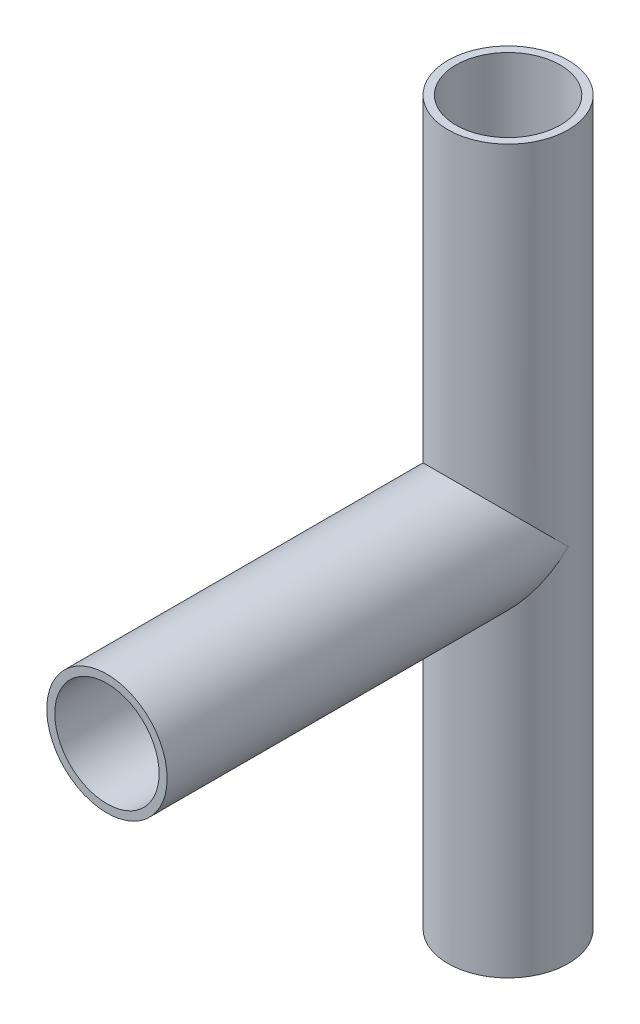
ISO-10303-21;
HEADER;
FILE_DESCRIPTION(('STEP AP214'),'2;1');
FILE_NAME('part.step','',(''),(''),'','','');
FILE_SCHEMA(('AUTOMOTIVE_DESIGN { 1 0 10303 214 1 1 1 1 }'));
ENDSEC;
DATA;
#1=APPLICATION_CONTEXT('core data for automotive mechanical design processes');
#2=APPLICATION_PROTOCOL_DEFINITION('international standard','automotive_design',2000,#1);
#3=PRODUCT_CONTEXT('',#1,'mechanical');
#4=PRODUCT('Part','Part','',(#3));
#5=PRODUCT_RELATED_PRODUCT_CATEGORY('part','',(#4));
#6=PRODUCT_DEFINITION_FORMATION('','',#4);
#7=PRODUCT_DEFINITION_CONTEXT('part definition',#1,'design');
#8=PRODUCT_DEFINITION('design','',#6,#7);
#9=PRODUCT_DEFINITION_SHAPE('','',#8);
#10=(LENGTH_UNIT() NAMED_UNIT(*) SI_UNIT(.MILLI.,.METRE.));
#11=(NAMED_UNIT(*) PLANE_ANGLE_UNIT() SI_UNIT($,.RADIAN.));
#12=(NAMED_UNIT(*) SI_UNIT($,.STERADIAN.) SOLID_ANGLE_UNIT());
#13=UNCERTAINTY_MEASURE_WITH_UNIT(LENGTH_MEASURE(1.E-05),#10,'distance_accuracy_value','');
#14=(GEOMETRIC_REPRESENTATION_CONTEXT(3) GLOBAL_UNCERTAINTY_ASSIGNED_CONTEXT((#13)) GLOBAL_UNIT_ASSIGNED_CONTEXT((#10,
#11,#12)) REPRESENTATION_CONTEXT('',''));
#15=CARTESIAN_POINT('',(0.,0.,0.));
#16=DIRECTION('',(0.,0.,1.));
#17=DIRECTION('',(1.,0.,0.));
#18=AXIS2_PLACEMENT_3D('',#15,#16,#17);
#19=CARTESIAN_POINT('',(0.,0.,100.));
#20=DIRECTION('',(0.,0.,1.));
#21=DIRECTION('',(1.,0.,0.));
#22=AXIS2_PLACEMENT_3D('',#19,#20,#21);
#23=PLANE('',#22);
#24=CARTESIAN_POINT('',(0.,0.,100.));
#25=DIRECTION('',(0.,0.,1.));
#26=DIRECTION('',(1.,0.,0.));
#27=AXIS2_PLACEMENT_3D('',#24,#25,#26);
#28=CIRCLE('',#27,15.);
#29=CARTESIAN_POINT('',(15.,0.,100.));
#30=VERTEX_POINT('',#29);
#31=EDGE_CURVE('E57',#30,#30,#28,.T.);
#32=ORIENTED_EDGE('',*,*,#31,.T.);
#33=EDGE_LOOP('',(#32));
#34=FACE_BOUND('',#33,.T.);
#35=CARTESIAN_POINT('',(0.,0.,100.));
#36=DIRECTION('',(0.,0.,1.));
#37=DIRECTION('',(1.,0.,0.));
#38=AXIS2_PLACEMENT_3D('',#35,#36,#37);
#39=CIRCLE('',#38,13.);
#40=CARTESIAN_POINT('',(13.,0.,100.));
#41=VERTEX_POINT('',#40);
#42=EDGE_CURVE('E68',#41,#41,#39,.T.);
#43=ORIENTED_EDGE('',*,*,#42,.F.);
#44=EDGE_LOOP('',(#43));
#45=FACE_BOUND('',#44,.T.);
#46=ADVANCED_FACE('F43',(#34,#45),#23,.T.);
#47=CARTESIAN_POINT('',(0.,0.,100.));
#48=DIRECTION('',(0.,0.,-1.));
#49=DIRECTION('',(-1.,0.,0.));
#50=AXIS2_PLACEMENT_3D('',#47,#48,#49);
#51=CYLINDRICAL_SURFACE('',#50,15.);
#52=ORIENTED_EDGE('',*,*,#31,.F.);
#53=EDGE_LOOP('',(#52));
#54=FACE_BOUND('',#53,.T.);
#55=CARTESIAN_POINT('',(0.,0.,0.));
#56=DIRECTION('',(0.,-0.707106781186547,-0.707106781186547));
#57=DIRECTION('',(0.,0.707106781186547,-0.707106781186547));
#58=AXIS2_PLACEMENT_3D('',#55,#56,#57);
#59=ELLIPSE('',#58,21.2132034355964,15.);
#60=CARTESIAN_POINT('',(-15.,0.,0.));
#61=VERTEX_POINT('',#60);
#62=CARTESIAN_POINT('',(15.,0.,0.));
#63=VERTEX_POINT('',#62);
#64=EDGE_CURVE('E63',#61,#63,#59,.F.);
#65=ORIENTED_EDGE('',*,*,#64,.T.);
#66=CARTESIAN_POINT('',(0.,0.,0.));
#67=DIRECTION('',(0.,0.707106781186547,-0.707106781186547));
#68=DIRECTION('',(0.,-0.707106781186547,-0.707106781186547));
#69=AXIS2_PLACEMENT_3D('',#66,#67,#68);
#70=ELLIPSE('',#69,21.2132034355964,15.);
#71=EDGE_CURVE('E66',#63,#61,#70,.F.);
#72=ORIENTED_EDGE('',*,*,#71,.T.);
#73=EDGE_LOOP('',(#65,#72));
#74=FACE_BOUND('',#73,.T.);
#75=ADVANCED_FACE('F45',(#54,#74),#51,.T.);
#76=CARTESIAN_POINT('',(0.,0.,100.));
#77=DIRECTION('',(0.,0.,-1.));
#78=DIRECTION('',(-1.,0.,0.));
#79=AXIS2_PLACEMENT_3D('',#76,#77,#78);
#80=CYLINDRICAL_SURFACE('',#79,13.);
#81=CARTESIAN_POINT('',(-13.,0.,7.48331477354788));
#82=CARTESIAN_POINT('',(-13.0000048156559,-0.213627067479387,7.4833003246179));
#83=CARTESIAN_POINT('',(-12.9947225538737,-0.427207910886152,7.4925035883206));
#84=CARTESIAN_POINT('',(-12.9737699949518,-0.852399344706233,7.52872787750463));
#85=CARTESIAN_POINT('',(-12.9580964960957,-1.06400930747348,7.55575439461912));
#86=CARTESIAN_POINT('',(-12.9167563210959,-1.48392947658318,7.62620831070965));
#87=CARTESIAN_POINT('',(-12.8910673644832,-1.69223124065642,7.669672270045));
#88=CARTESIAN_POINT('',(-12.8303031150206,-2.1039643133123,7.77089445155744));
#89=CARTESIAN_POINT('',(-12.7952238082706,-2.30739349850641,7.8286587856261));
#90=CARTESIAN_POINT('',(-12.699295239697,-2.79528085569982,7.98369463017449));
#91=CARTESIAN_POINT('',(-12.6338572837477,-3.07683562373358,8.08725925790537));
#92=CARTESIAN_POINT('',(-12.4867226941164,-3.62812236999403,8.31263286381787));
#93=CARTESIAN_POINT('',(-12.4050168693557,-3.89784755909902,8.43445214591076));
#94=CARTESIAN_POINT('',(-12.2263177464159,-4.42665577428554,8.69147425987861));
#95=CARTESIAN_POINT('',(-12.1292776142507,-4.68570302755821,8.82671760486709));
#96=CARTESIAN_POINT('',(-11.9209418948856,-5.19290727800297,9.10612772352582));
#97=CARTESIAN_POINT('',(-11.8096473679925,-5.44106508334018,9.25029383306852));
#98=CARTESIAN_POINT('',(-11.5074960699785,-6.06256794886113,9.62619183955482));
#99=CARTESIAN_POINT('',(-11.3068337706012,-6.42871418910982,9.86200070582975));
#100=CARTESIAN_POINT('',(-10.8729533804489,-7.13804820592398,10.3384211257774));
#101=CARTESIAN_POINT('',(-10.6397184831307,-7.48122399429485,10.5790351034738));
#102=CARTESIAN_POINT('',(-10.1410702929338,-8.14435817480119,11.0579429181015));
#103=CARTESIAN_POINT('',(-9.87569141709703,-8.46434082336414,11.2962389465694));
#104=CARTESIAN_POINT('',(-9.31238940979132,-9.0803892763195,11.7649308895132));
#105=CARTESIAN_POINT('',(-9.0144804422082,-9.37646539291769,11.9953301853348));
#106=CARTESIAN_POINT('',(-8.45722681189462,-9.87836994310842,12.3921069188039));
#107=CARTESIAN_POINT('',(-8.20447449203922,-10.0894301550715,12.5611469660348));
#108=CARTESIAN_POINT('',(-7.67937170865023,-10.4946275079386,12.8888713026245));
#109=CARTESIAN_POINT('',(-7.40702182420929,-10.6887651485168,13.0475558977148));
#110=CARTESIAN_POINT('',(-6.84340762830615,-11.0580796948545,13.3517861507291));
#111=CARTESIAN_POINT('',(-6.5521695050437,-11.2332819914109,13.4973493587863));
#112=CARTESIAN_POINT('',(-5.95114840729962,-11.5629247371093,13.7729099213994));
#113=CARTESIAN_POINT('',(-5.64136912011711,-11.717369294665,13.9029103556126));
#114=CARTESIAN_POINT('',(-5.06321221098687,-11.9768508112759,14.1223615372577));
#115=CARTESIAN_POINT('',(-4.79772299781424,-12.0857480001424,14.2148702754271));
#116=CARTESIAN_POINT('',(-4.25626512596076,-12.2868862249304,14.386271293928));
#117=CARTESIAN_POINT('',(-3.98029859604719,-12.3791306226559,14.4651663224026));
#118=CARTESIAN_POINT('',(-3.41930165917376,-12.5456746146877,14.6079469627872));
#119=CARTESIAN_POINT('',(-3.13427445495683,-12.6199804717694,14.6718378128035));
#120=CARTESIAN_POINT('',(-2.55677989102856,-12.7495268240173,14.7834146972498));
#121=CARTESIAN_POINT('',(-2.26431244867102,-12.8047671073035,14.83110055159));
#122=CARTESIAN_POINT('',(-1.6725025503167,-12.8954564300705,14.9094692117402));
#123=CARTESIAN_POINT('',(-1.37313263158431,-12.9308030595146,14.9400640291343));
#124=CARTESIAN_POINT('',(-0.771356027560767,-12.9806069443973,14.9831906132142));
#125=CARTESIAN_POINT('',(-0.468949335557063,-12.9950641536512,14.9957223399641));
#126=CARTESIAN_POINT('',(0.136302360481002,-13.0028077975621,15.0024333698811));
#127=CARTESIAN_POINT('',(0.439147307755855,-12.9960967645226,14.9966148682397));
#128=CARTESIAN_POINT('',(1.04271910610427,-12.9616394991092,14.9667639788183));
#129=CARTESIAN_POINT('',(1.34344605979864,-12.9338942930566,14.9427324797058));
#130=CARTESIAN_POINT('',(1.91599341805324,-12.8610015054534,14.8796860371561));
#131=CARTESIAN_POINT('',(2.18817327733244,-12.8174553358075,14.842050857067));
#132=CARTESIAN_POINT('',(2.72694092205025,-12.7137344603536,14.7525711612599));
#133=CARTESIAN_POINT('',(2.993529077974,-12.6535608599847,14.7007275901581));
#134=CARTESIAN_POINT('',(3.51961050859718,-12.5174346056851,14.5837224256923));
#135=CARTESIAN_POINT('',(3.77910442274504,-12.4414833792324,14.5185620371736));
#136=CARTESIAN_POINT('',(4.28989040462068,-12.2747324009951,14.3759239851654));
#137=CARTESIAN_POINT('',(4.54117936193399,-12.183927094811,14.2984417144461));
#138=CARTESIAN_POINT('',(5.05216420181103,-11.9815052454165,14.1263380798196));
#139=CARTESIAN_POINT('',(5.31117388969982,-11.8688641697255,14.0308868000792));
#140=CARTESIAN_POINT('',(5.8177729499126,-11.6289344988018,13.8285199105169));
#141=CARTESIAN_POINT('',(6.06535778426873,-11.501640152242,13.7215998003732));
#142=CARTESIAN_POINT('',(6.54846925480783,-11.233604896795,13.4977199458126));
#143=CARTESIAN_POINT('',(6.78399326105708,-11.092861074186,13.3807580264777));
#144=CARTESIAN_POINT('',(7.24258952369051,-10.7990318405922,13.1381969943166));
#145=CARTESIAN_POINT('',(7.46565921178771,-10.645943899838,13.0125961118246));
#146=CARTESIAN_POINT('',(8.00992170269758,-10.247242795629,12.6880456425746));
#147=CARTESIAN_POINT('',(8.3230106408243,-9.99432204383877,12.4844104539381));
#148=CARTESIAN_POINT('',(8.92014895028881,-9.46521154319403,12.064997836085));
#149=CARTESIAN_POINT('',(9.20418477879975,-9.18901105114437,11.8492148162783));
#150=CARTESIAN_POINT('',(9.74393693643393,-8.61460331177179,11.4095186832644));
#151=CARTESIAN_POINT('',(9.999584228708,-8.31634523367056,11.1855874361219));
#152=CARTESIAN_POINT('',(10.4819485737158,-7.69948487471419,10.7348782105233));
#153=CARTESIAN_POINT('',(10.708673808988,-7.38088838638313,10.5081010572542));
#154=CARTESIAN_POINT('',(11.0961596067777,-6.78081830591129,10.0965625109094));
#155=CARTESIAN_POINT('',(11.2615231608475,-6.50259055323078,9.91138604493106));
#156=CARTESIAN_POINT('',(11.5724283459713,-5.93166288708029,9.54653415751812));
#157=CARTESIAN_POINT('',(11.7179656373737,-5.63895982424553,9.3668599470895));
#158=CARTESIAN_POINT('',(11.9882461084205,-5.03884544759648,9.01833858646219));
#159=CARTESIAN_POINT('',(12.1130369274856,-4.73146997648226,8.84946719495245));
#160=CARTESIAN_POINT('',(12.3409303096415,-4.10048825627148,8.5287803117248));
#161=CARTESIAN_POINT('',(12.444049653589,-3.77689480749786,8.37695166607086));
#162=CARTESIAN_POINT('',(12.6424617565592,-3.05467362740738,8.07503166898653));
#163=CARTESIAN_POINT('',(12.7333709326661,-2.65270208915101,7.92971429104775));
#164=CARTESIAN_POINT('',(12.8415903361138,-2.03402703773163,7.75231574145442));
#165=CARTESIAN_POINT('',(12.8729472273202,-1.82550025761203,7.6999930514717));
#166=CARTESIAN_POINT('',(12.9257118211877,-1.40392560569307,7.61108762101807));
#167=CARTESIAN_POINT('',(12.9471260906801,-1.19088081543882,7.57449449278792));
#168=CARTESIAN_POINT('',(12.9754514945868,-0.814808206396623,7.52583791689558));
#169=CARTESIAN_POINT('',(12.9846395438317,-0.652439416908968,7.50994633379833));
#170=CARTESIAN_POINT('',(12.9969161937054,-0.32672424030356,7.48867898494042));
#171=CARTESIAN_POINT('',(13.0000025594169,-0.163377516954199,7.48330707231849));
#172=CARTESIAN_POINT('',(12.9999961680276,0.244609674868714,7.4833263038689));
#173=CARTESIAN_POINT('',(12.9930681287809,0.489288377406845,7.49539690322318));
#174=CARTESIAN_POINT('',(12.9656332092011,0.975575055377208,7.54274875464709));
#175=CARTESIAN_POINT('',(12.9451236234015,1.21718240921645,7.57803463122914));
#176=CARTESIAN_POINT('',(12.8913616625692,1.69417955220695,7.6691299665961));
#177=CARTESIAN_POINT('',(12.8581491882262,1.92958636759118,7.72487513931604));
#178=CARTESIAN_POINT('',(12.77989412673,2.39369190959364,7.85365929101569));
#179=CARTESIAN_POINT('',(12.7348432336368,2.6223858006296,7.92671040844294));
#180=CARTESIAN_POINT('',(12.6336471189395,3.07320005241503,8.08702423441608));
#181=CARTESIAN_POINT('',(12.5774588897965,3.29529096701753,8.17434179656661));
#182=CARTESIAN_POINT('',(12.4548980686429,3.73187810072892,8.35989858839835));
#183=CARTESIAN_POINT('',(12.3885261011975,3.94637478459711,8.45813714819686));
#184=CARTESIAN_POINT('',(12.1956031279908,4.5180051269049,8.73570724081925));
#185=CARTESIAN_POINT('',(12.0598109490539,4.8681510108727,8.92304501804945));
#186=CARTESIAN_POINT('',(11.7621112717851,5.54895135822722,9.31197683452289));
#187=CARTESIAN_POINT('',(11.600184916993,5.87959151074115,9.51358110797313));
#188=CARTESIAN_POINT('',(11.2509402662477,6.52307263655535,9.92416768292867));
#189=CARTESIAN_POINT('',(11.0635882902015,6.83588920594841,10.1331594940991));
#190=CARTESIAN_POINT('',(10.6640314241151,7.44383563649059,10.552839189928));
#191=CARTESIAN_POINT('',(10.451832835446,7.73896995347206,10.7635266319877));
#192=CARTESIAN_POINT('',(9.98814789955114,8.32987336613415,11.1956986136767));
#193=CARTESIAN_POINT('',(9.73501843289032,8.62448071773944,11.4170140193127));
#194=CARTESIAN_POINT('',(9.20025382931214,9.19279921915117,11.8521815917754));
#195=CARTESIAN_POINT('',(8.91861327454861,9.46650637997854,12.0660323296995));
#196=CARTESIAN_POINT('',(8.32735456536266,9.99053846446263,12.4814032555993));
#197=CARTESIAN_POINT('',(8.01780024042138,10.2409141988508,12.6829498923668));
#198=CARTESIAN_POINT('',(7.37038336096848,10.7162756309532,13.0697937584176));
#199=CARTESIAN_POINT('',(7.03253292651164,10.9412721034148,13.2550978759454));
#200=CARTESIAN_POINT('',(6.42842143466152,11.3031885398194,13.555625958409));
#201=CARTESIAN_POINT('',(6.16880674259344,11.4470641056575,13.6758858448774));
#202=CARTESIAN_POINT('',(5.63599301298037,11.7185721418557,13.9039383524327));
#203=CARTESIAN_POINT('',(5.36279747244497,11.8462087638517,14.0117341594315));
#204=CARTESIAN_POINT('',(4.80379916427,12.0836953906903,14.2130831625081));
#205=CARTESIAN_POINT('',(4.51800052828808,12.1935511702521,14.3066409820929));
#206=CARTESIAN_POINT('',(3.9350418907809,12.3939674898524,14.4778352830911));
#207=CARTESIAN_POINT('',(3.63788165672425,12.4845276347284,14.5554714384378));
#208=CARTESIAN_POINT('',(3.03158687598138,12.6454981398006,14.6937712064819));
#209=CARTESIAN_POINT('',(2.72237558087853,12.7157415891106,14.7542941403229));
#210=CARTESIAN_POINT('',(2.09655977189269,12.8337762549899,14.8561408795491));
#211=CARTESIAN_POINT('',(1.77995525029424,12.8815674481272,14.8974646648976));
#212=CARTESIAN_POINT('',(1.1422746355091,12.9536908732158,14.9598723317427));
#213=CARTESIAN_POINT('',(0.82120111517169,12.9780360791317,14.9809674068786));
#214=CARTESIAN_POINT('',(0.177456907822479,13.0027776525459,15.0024060217504));
#215=CARTESIAN_POINT('',(-0.145213596857165,13.0031766937157,15.0027518782077));
#216=CARTESIAN_POINT('',(-0.749967947134532,12.9814372423943,14.9839144796605));
#217=CARTESIAN_POINT('',(-1.03223024869972,12.9620249131688,14.967093484882));
#218=CARTESIAN_POINT('',(-1.59350687123525,12.9050488405453,14.9177773460301));
#219=CARTESIAN_POINT('',(-1.87252150395209,12.8674868543111,14.8852837193075));
#220=CARTESIAN_POINT('',(-2.42542465121767,12.7748152822444,14.8052477489848));
#221=CARTESIAN_POINT('',(-2.69931291405851,12.7197048371524,14.7577046684896));
#222=CARTESIAN_POINT('',(-3.24029291483311,12.5927640783548,14.6484355508355));
#223=CARTESIAN_POINT('',(-3.50738432459466,12.5209329590183,14.5867088302862));
#224=CARTESIAN_POINT('',(-4.03600969048719,12.3607312649119,14.449427523974));
#225=CARTESIAN_POINT('',(-4.29746062303673,12.2722014554648,14.3737399790263));
#226=CARTESIAN_POINT('',(-4.81094408074569,12.0801488165919,14.2101184689348));
#227=CARTESIAN_POINT('',(-5.06297294660943,11.9766202365784,14.1221798071633));
#228=CARTESIAN_POINT('',(-5.55664995376165,11.7557123391744,13.9353255961042));
#229=CARTESIAN_POINT('',(-5.79829823633451,11.6383332103776,13.8364101962807));
#230=CARTESIAN_POINT('',(-6.27064339068444,11.3907928697619,13.6288523733122));
#231=CARTESIAN_POINT('',(-6.50133799638701,11.2606290300117,13.5202079507476));
#232=CARTESIAN_POINT('',(-7.05662266753142,10.9248800504639,13.2416217620266));
#233=CARTESIAN_POINT('',(-7.37467047036881,10.7124906580391,13.0667745717302));
#234=CARTESIAN_POINT('',(-7.98564889575346,10.2651304906462,12.7025985103759));
#235=CARTESIAN_POINT('',(-8.27856936600491,10.0301506689365,12.5132638437951));
#236=CARTESIAN_POINT('',(-8.83978158109448,9.53926582024995,12.1233361948304));
#237=CARTESIAN_POINT('',(-9.10801020867842,9.28331016489417,11.9227163627857));
#238=CARTESIAN_POINT('',(-9.61909911678679,8.75263661668074,11.5143349944955));
#239=CARTESIAN_POINT('',(-9.86196304057572,8.47792142775325,11.3065744896156));
#240=CARTESIAN_POINT('',(-10.3272159129245,7.90490826152805,10.8834478473357));
#241=CARTESIAN_POINT('',(-10.549093694905,7.60624663671467,10.6680128115659));
#242=CARTESIAN_POINT('',(-10.966864289378,6.99044997772242,10.2380521462976));
#243=CARTESIAN_POINT('',(-11.1627487506404,6.6733090533153,10.0235268304034));
#244=CARTESIAN_POINT('',(-11.5278838913496,6.02059462113899,9.60133471340906));
#245=CARTESIAN_POINT('',(-11.6971782645633,5.68505260147148,9.39365711324214));
#246=CARTESIAN_POINT('',(-12.008569944512,4.99378169410769,8.99213909370367));
#247=CARTESIAN_POINT('',(-12.1506882948251,4.63806870469112,8.79828804136689));
#248=CARTESIAN_POINT('',(-12.3480740871087,4.07064382033627,8.51703908829108));
#249=CARTESIAN_POINT('',(-12.4135337390656,3.86664083309679,8.42117690193254));
#250=CARTESIAN_POINT('',(-12.5352243542044,3.45179271526801,8.23893923307896));
#251=CARTESIAN_POINT('',(-12.591458584155,3.2409500384617,8.15256039608129));
#252=CARTESIAN_POINT('',(-12.6939309435831,2.81289806903876,7.99206955930646));
#253=CARTESIAN_POINT('',(-12.740195491573,2.59570737872185,7.91792526480426));
#254=CARTESIAN_POINT('',(-12.8221151708348,2.15490033071753,7.78456732716292));
#255=CARTESIAN_POINT('',(-12.8577752610374,1.93128703023213,7.72534670729373));
#256=CARTESIAN_POINT('',(-12.9245198974832,1.42667981824246,7.61327977715434));
#257=CARTESIAN_POINT('',(-12.9526969944486,1.14424988500072,7.56498210882826));
#258=CARTESIAN_POINT('',(-12.9904300153333,0.57451742713748,7.5000157628963));
#259=CARTESIAN_POINT('',(-12.9999935254556,0.287216935751811,7.48333419981928));
#260=CARTESIAN_POINT('',(-13.,0.,7.48331477354788));
#261=B_SPLINE_CURVE_WITH_KNOTS('',3,(#81,#82,#83,#84,#85,#86,#87,#88,#89,#90,#91,#92,#93,#94,
#95,#96,#97,#98,#99,#100,#101,#102,#103,#104,#105,#106,#107,#108,#109,#110,#111,#112,#113,#114,
#115,#116,#117,#118,#119,#120,#121,#122,#123,#124,#125,#126,#127,#128,#129,#130,#131,#132,#133,
#134,#135,#136,#137,#138,#139,#140,#141,#142,#143,#144,#145,#146,#147,#148,#149,#150,#151,#152,
#153,#154,#155,#156,#157,#158,#159,#160,#161,#162,#163,#164,#165,#166,#167,#168,#169,#170,#171,
#172,#173,#174,#175,#176,#177,#178,#179,#180,#181,#182,#183,#184,#185,#186,#187,#188,#189,#190,
#191,#192,#193,#194,#195,#196,#197,#198,#199,#200,#201,#202,#203,#204,#205,#206,#207,#208,#209,
#210,#211,#212,#213,#214,#215,#216,#217,#218,#219,#220,#221,#222,#223,#224,#225,#226,#227,#228,
#229,#230,#231,#232,#233,#234,#235,#236,#237,#238,#239,#240,#241,#242,#243,#244,#245,#246,#247,
#248,#249,#250,#251,#252,#253,#254,#255,#256,#257,#258,#259,#260),.UNSPECIFIED.,.T.,.F.,(4,2,2,
2,2,2,2,2,2,2,2,2,2,2,2,2,2,2,2,2,2,2,2,2,2,2,2,2,2,2,2,2,2,2,2,2,2,2,2,2,2,2,2,2,2,2,2,2,2,2,2,
2,2,2,2,2,2,2,2,2,2,2,2,2,2,2,2,2,2,2,2,2,2,2,2,2,2,2,2,2,2,2,2,2,2,2,2,2,2,4),(0.,
0.640546703416717,1.28129086191991,1.92346863399244,2.5659213441374,3.48552764398017,
4.40565498819955,5.32864892236856,6.25157423988537,7.68818680259998,9.12554337454889,
10.5613743301825,11.9965825867153,13.106065541426,14.2155157252385,15.323459267234,
16.4311831988572,17.3348050527174,18.2382442822448,19.141367641814,20.0445010376684,
20.9522420951583,21.8599851595788,22.7676196371032,23.6752098312282,24.508879955497,
25.3424946683305,26.1760339928453,27.0098857189643,27.9034376789474,28.7973415566482,
29.6914395324489,30.5857212101954,31.9369573834118,33.2888205790957,34.6439024642927,
35.9986001196379,37.1164930990499,38.2346303755375,39.3501635456793,40.4648297170806,
41.7708765486614,42.4219894372176,43.072671669522,43.5624521256139,44.0524119446739,
44.7859823543195,45.5196989363753,46.2511295413719,46.9830747011623,47.7179034002381,
48.4526870505266,49.709766474191,50.9677570005627,52.227430494646,53.4867852109729,
54.8265179236066,56.1665056998003,57.5035035218829,58.839931568937,59.7998539779428,
60.7595304786499,61.7188946752074,62.678278517049,63.6453337321471,64.6123899564951,
65.5789107470178,66.5453236219725,67.3945867628263,68.2437676985099,69.0929902206955,
69.942253668362,70.800067307662,71.6582107107682,72.5163424304555,73.3746509120211,
74.6343499348685,75.8945555449635,77.1578978879251,78.4210585201612,79.7096713220156,
80.9986971369004,82.2855821038968,83.5714665083496,84.2752357579064,84.9787552587612,
85.6803869427437,86.3816900069908,87.2432422977336,88.1044433783459),.UNSPECIFIED.);
#262=CARTESIAN_POINT('',(-13.,0.,7.48331477354788));
#263=VERTEX_POINT('',#262);
#264=EDGE_CURVE('E11',#263,#263,#261,.T.);
#265=ORIENTED_EDGE('',*,*,#264,.F.);
#266=EDGE_LOOP('',(#265));
#267=FACE_BOUND('',#266,.T.);
#268=ORIENTED_EDGE('',*,*,#42,.T.);
#269=EDGE_LOOP('',(#268));
#270=FACE_BOUND('',#269,.T.);
#271=ADVANCED_FACE('F90',(#267,#270),#80,.F.);
#272=CARTESIAN_POINT('',(0.,90.,0.));
#273=DIRECTION('',(0.,-1.,0.));
#274=DIRECTION('',(0.,0.,-1.));
#275=AXIS2_PLACEMENT_3D('',#272,#273,#274);
#276=CYLINDRICAL_SURFACE('',#275,15.);
#277=CARTESIAN_POINT('',(0.,90.,0.));
#278=DIRECTION('',(0.,1.,0.));
#279=DIRECTION('',(0.,0.,1.));
#280=AXIS2_PLACEMENT_3D('',#277,#278,#279);
#281=CIRCLE('',#280,15.);
#282=CARTESIAN_POINT('',(0.,90.,15.));
#283=VERTEX_POINT('',#282);
#284=EDGE_CURVE('E73',#283,#283,#281,.T.);
#285=ORIENTED_EDGE('',*,*,#284,.F.);
#286=EDGE_LOOP('',(#285));
#287=FACE_BOUND('',#286,.T.);
#288=ORIENTED_EDGE('',*,*,#71,.F.);
#289=ORIENTED_EDGE('',*,*,#64,.F.);
#290=EDGE_LOOP('',(#288,#289));
#291=FACE_BOUND('',#290,.T.);
#292=CARTESIAN_POINT('',(0.,-90.,0.));
#293=DIRECTION('',(0.,-1.,0.));
#294=DIRECTION('',(0.,0.,-1.));
#295=AXIS2_PLACEMENT_3D('',#292,#293,#294);
#296=CIRCLE('',#295,15.);
#297=CARTESIAN_POINT('',(0.,-90.,-15.));
#298=VERTEX_POINT('',#297);
#299=EDGE_CURVE('E121',#298,#298,#296,.T.);
#300=ORIENTED_EDGE('',*,*,#299,.F.);
#301=EDGE_LOOP('',(#300));
#302=FACE_BOUND('',#301,.T.);
#303=ADVANCED_FACE('F70',(#287,#291,#302),#276,.T.);
#304=CARTESIAN_POINT('',(0.,90.,0.));
#305=DIRECTION('',(0.,1.,0.));
#306=DIRECTION('',(0.,0.,1.));
#307=AXIS2_PLACEMENT_3D('',#304,#305,#306);
#308=PLANE('',#307);
#309=ORIENTED_EDGE('',*,*,#284,.T.);
#310=EDGE_LOOP('',(#309));
#311=FACE_BOUND('',#310,.T.);
#312=CARTESIAN_POINT('',(0.,90.,0.));
#313=DIRECTION('',(0.,1.,0.));
#314=DIRECTION('',(0.,0.,1.));
#315=AXIS2_PLACEMENT_3D('',#312,#313,#314);
#316=CIRCLE('',#315,13.);
#317=CARTESIAN_POINT('',(0.,90.,-13.));
#318=VERTEX_POINT('',#317);
#319=EDGE_CURVE('E77',#318,#318,#316,.T.);
#320=ORIENTED_EDGE('',*,*,#319,.F.);
#321=EDGE_LOOP('',(#320));
#322=FACE_BOUND('',#321,.T.);
#323=ADVANCED_FACE('F105',(#311,#322),#308,.T.);
#324=ORIENTED_EDGE('',*,*,#264,.T.);
#325=EDGE_LOOP('',(#324));
#326=FACE_BOUND('',#325,.T.);
#327=ADVANCED_FACE('F101',(#326),#276,.T.);
#328=CARTESIAN_POINT('',(0.,90.,0.));
#329=DIRECTION('',(0.,-1.,0.));
#330=DIRECTION('',(0.,0.,-1.));
#331=AXIS2_PLACEMENT_3D('',#328,#329,#330);
#332=CYLINDRICAL_SURFACE('',#331,13.);
#333=CARTESIAN_POINT('',(0.,-90.,0.));
#334=DIRECTION('',(0.,-1.,0.));
#335=DIRECTION('',(0.,0.,-1.));
#336=AXIS2_PLACEMENT_3D('',#333,#334,#335);
#337=CIRCLE('',#336,13.);
#338=CARTESIAN_POINT('',(0.,-90.,-13.));
#339=VERTEX_POINT('',#338);
#340=EDGE_CURVE('E124',#339,#339,#337,.T.);
#341=CARTESIAN_POINT('',(0.,90.,-13.));
#342=CARTESIAN_POINT('',(0.,88.125,-13.));
#343=CARTESIAN_POINT('',(0.,86.25,-13.));
#344=CARTESIAN_POINT('',(0.,82.5,-13.));
#345=CARTESIAN_POINT('',(0.,80.625,-13.));
#346=CARTESIAN_POINT('',(0.,76.875,-13.));
#347=CARTESIAN_POINT('',(0.,75.,-13.));
#348=CARTESIAN_POINT('',(0.,71.25,-13.));
#349=CARTESIAN_POINT('',(0.,69.375,-13.));
#350=CARTESIAN_POINT('',(0.,65.625,-13.));
#351=CARTESIAN_POINT('',(0.,63.75,-13.));
#352=CARTESIAN_POINT('',(0.,60.,-13.));
#353=CARTESIAN_POINT('',(0.,58.125,-13.));
#354=CARTESIAN_POINT('',(0.,54.375,-13.));
#355=CARTESIAN_POINT('',(0.,52.5,-13.));
#356=CARTESIAN_POINT('',(0.,48.75,-13.));
#357=CARTESIAN_POINT('',(0.,46.875,-13.));
#358=CARTESIAN_POINT('',(0.,43.125,-13.));
#359=CARTESIAN_POINT('',(0.,41.25,-13.));
#360=CARTESIAN_POINT('',(0.,37.5,-13.));
#361=CARTESIAN_POINT('',(0.,35.625,-13.));
#362=CARTESIAN_POINT('',(0.,31.875,-13.));
#363=CARTESIAN_POINT('',(0.,30.,-13.));
#364=CARTESIAN_POINT('',(0.,26.25,-13.));
#365=CARTESIAN_POINT('',(0.,24.375,-13.));
#366=CARTESIAN_POINT('',(0.,20.625,-13.));
#367=CARTESIAN_POINT('',(0.,18.75,-13.));
#368=CARTESIAN_POINT('',(0.,15.,-13.));
#369=CARTESIAN_POINT('',(0.,13.125,-13.));
#370=CARTESIAN_POINT('',(0.,9.37500000000001,-13.));
#371=CARTESIAN_POINT('',(0.,7.50000000000002,-13.));
#372=CARTESIAN_POINT('',(0.,3.75000000000002,-13.));
#373=CARTESIAN_POINT('',(0.,1.87500000000002,-13.));
#374=CARTESIAN_POINT('',(0.,-1.87499999999999,-13.));
#375=CARTESIAN_POINT('',(0.,-3.74999999999999,-13.));
#376=CARTESIAN_POINT('',(0.,-7.49999999999999,-13.));
#377=CARTESIAN_POINT('',(0.,-9.37499999999999,-13.));
#378=CARTESIAN_POINT('',(0.,-13.125,-13.));
#379=CARTESIAN_POINT('',(0.,-15.,-13.));
#380=CARTESIAN_POINT('',(0.,-18.75,-13.));
#381=CARTESIAN_POINT('',(0.,-20.625,-13.));
#382=CARTESIAN_POINT('',(0.,-24.375,-13.));
#383=CARTESIAN_POINT('',(0.,-26.25,-13.));
#384=CARTESIAN_POINT('',(0.,-30.,-13.));
#385=CARTESIAN_POINT('',(0.,-31.875,-13.));
#386=CARTESIAN_POINT('',(0.,-35.625,-13.));
#387=CARTESIAN_POINT('',(0.,-37.5,-13.));
#388=CARTESIAN_POINT('',(0.,-41.25,-13.));
#389=CARTESIAN_POINT('',(0.,-43.125,-13.));
#390=CARTESIAN_POINT('',(0.,-46.875,-13.));
#391=CARTESIAN_POINT('',(0.,-48.75,-13.));
#392=CARTESIAN_POINT('',(0.,-52.5,-13.));
#393=CARTESIAN_POINT('',(0.,-54.375,-13.));
#394=CARTESIAN_POINT('',(0.,-58.125,-13.));
#395=CARTESIAN_POINT('',(0.,-60.,-13.));
#396=CARTESIAN_POINT('',(0.,-63.75,-13.));
#397=CARTESIAN_POINT('',(0.,-65.625,-13.));
#398=CARTESIAN_POINT('',(0.,-69.375,-13.));
#399=CARTESIAN_POINT('',(0.,-71.25,-13.));
#400=CARTESIAN_POINT('',(0.,-75.,-13.));
#401=CARTESIAN_POINT('',(0.,-76.875,-13.));
#402=CARTESIAN_POINT('',(0.,-80.625,-13.));
#403=CARTESIAN_POINT('',(0.,-82.5,-13.));
#404=CARTESIAN_POINT('',(0.,-86.25,-13.));
#405=CARTESIAN_POINT('',(0.,-88.125,-13.));
#406=CARTESIAN_POINT('',(0.,-90.,-13.));
#407=B_SPLINE_CURVE_WITH_KNOTS('',3,(#341,#342,#343,#344,#345,#346,#347,#348,#349,#350,#351,
#352,#353,#354,#355,#356,#357,#358,#359,#360,#361,#362,#363,#364,#365,#366,#367,#368,#369,#370,
#371,#372,#373,#374,#375,#376,#377,#378,#379,#380,#381,#382,#383,#384,#385,#386,#387,#388,#389,
#390,#391,#392,#393,#394,#395,#396,#397,#398,#399,#400,#401,#402,#403,#404,#405,#406),
.UNSPECIFIED.,.F.,.F.,(4,2,2,2,2,2,2,2,2,2,2,2,2,2,2,2,2,2,2,2,2,2,2,2,2,2,2,2,2,2,2,2,4),(0.,
5.62500000000001,11.25,16.875,22.5,28.125,33.75,39.375,45.,50.625,56.25,61.875,67.5,73.125,
78.75,84.375,90.,95.625,101.25,106.875,112.5,118.125,123.75,129.375,135.,140.625,146.25,151.875,
157.5,163.125,168.75,174.375,180.),.UNSPECIFIED.);
#408=EDGE_CURVE('BSEAM104',#318,#339,#407,.T.);
#409=ORIENTED_EDGE('',*,*,#319,.T.);
#410=ORIENTED_EDGE('',*,*,#340,.T.);
#411=ORIENTED_EDGE('',*,*,#408,.T.);
#412=ORIENTED_EDGE('',*,*,#408,.F.);
#413=EDGE_LOOP('',(#409,#411,#410,#412));
#414=FACE_BOUND('',#413,.T.);
#415=ADVANCED_FACE('F104',(#414),#332,.F.);
#416=CARTESIAN_POINT('',(0.,-90.,0.));
#417=DIRECTION('',(0.,-1.,0.));
#418=DIRECTION('',(0.,0.,-1.));
#419=AXIS2_PLACEMENT_3D('',#416,#417,#418);
#420=PLANE('',#419);
#421=ORIENTED_EDGE('',*,*,#299,.T.);
#422=EDGE_LOOP('',(#421));
#423=FACE_BOUND('',#422,.T.);
#424=ORIENTED_EDGE('',*,*,#340,.F.);
#425=EDGE_LOOP('',(#424));
#426=FACE_BOUND('',#425,.T.);
#427=ADVANCED_FACE('F112',(#423,#426),#420,.T.);
#428=CLOSED_SHELL('',(#46,#75,#271,#303,#323,#327,#415,#427));
#429=MANIFOLD_SOLID_BREP('B2',#428);
#430=ADVANCED_BREP_SHAPE_REPRESENTATION('',(#18,#429),#14);
#431=SHAPE_DEFINITION_REPRESENTATION(#9,#430);
ENDSEC;
END-ISO-10303-21;
